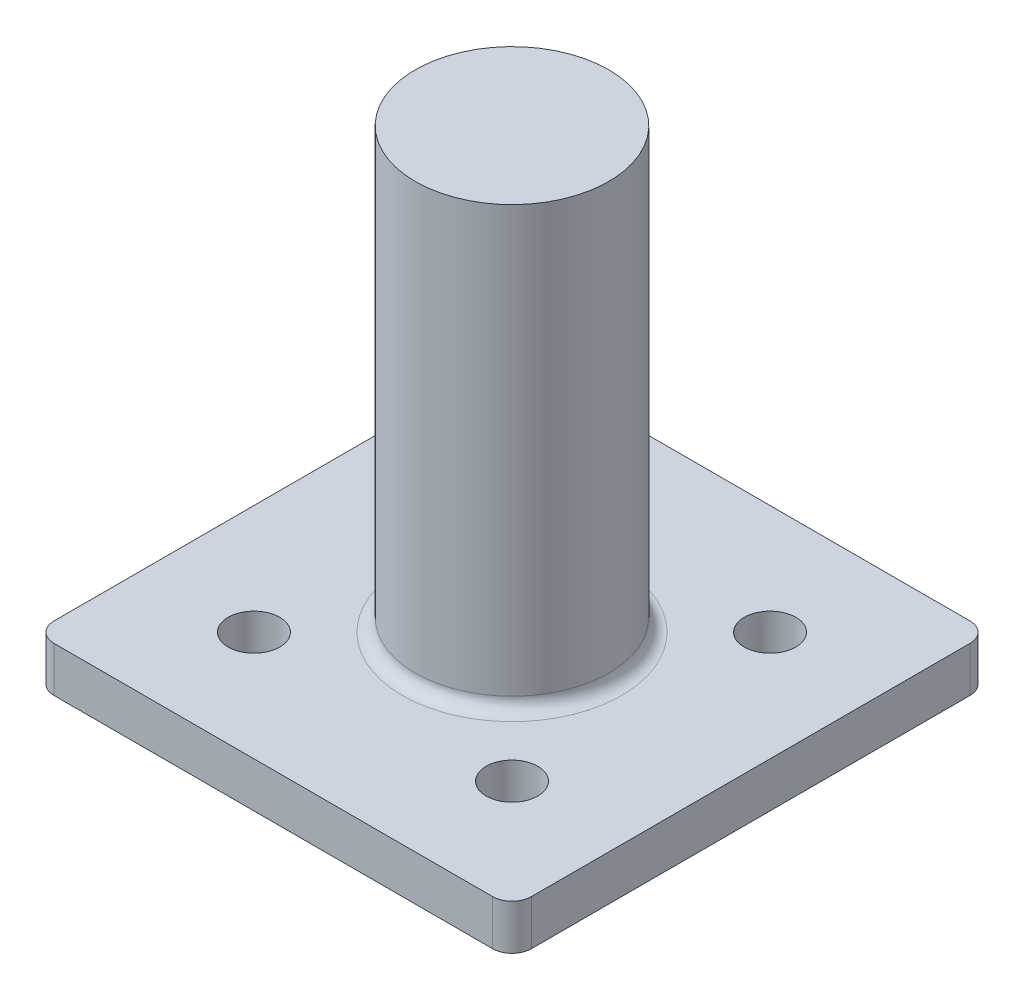
ISO-10303-21;
HEADER;
FILE_DESCRIPTION(('STEP AP214'),'2;1');
FILE_NAME('part.step','',(''),(''),'','','');
FILE_SCHEMA(('AUTOMOTIVE_DESIGN { 1 0 10303 214 1 1 1 1 }'));
ENDSEC;
DATA;
#1=APPLICATION_CONTEXT('core data for automotive mechanical design processes');
#2=APPLICATION_PROTOCOL_DEFINITION('international standard','automotive_design',2000,#1);
#3=PRODUCT_CONTEXT('',#1,'mechanical');
#4=PRODUCT('Part','Part','',(#3));
#5=PRODUCT_RELATED_PRODUCT_CATEGORY('part','',(#4));
#6=PRODUCT_DEFINITION_FORMATION('','',#4);
#7=PRODUCT_DEFINITION_CONTEXT('part definition',#1,'design');
#8=PRODUCT_DEFINITION('design','',#6,#7);
#9=PRODUCT_DEFINITION_SHAPE('','',#8);
#10=(LENGTH_UNIT() NAMED_UNIT(*) SI_UNIT(.MILLI.,.METRE.));
#11=(NAMED_UNIT(*) PLANE_ANGLE_UNIT() SI_UNIT($,.RADIAN.));
#12=(NAMED_UNIT(*) SI_UNIT($,.STERADIAN.) SOLID_ANGLE_UNIT());
#13=UNCERTAINTY_MEASURE_WITH_UNIT(LENGTH_MEASURE(1.E-05),#10,'distance_accuracy_value','');
#14=(GEOMETRIC_REPRESENTATION_CONTEXT(3) GLOBAL_UNCERTAINTY_ASSIGNED_CONTEXT((#13)) GLOBAL_UNIT_ASSIGNED_CONTEXT((#10,
#11,#12)) REPRESENTATION_CONTEXT('',''));
#15=CARTESIAN_POINT('',(0.,0.,0.));
#16=DIRECTION('',(0.,0.,1.));
#17=DIRECTION('',(1.,0.,0.));
#18=AXIS2_PLACEMENT_3D('',#15,#16,#17);
#19=CARTESIAN_POINT('',(3.,7.,-3.));
#20=DIRECTION('',(0.,-1.,0.));
#21=DIRECTION('',(0.,0.,-1.));
#22=AXIS2_PLACEMENT_3D('',#19,#20,#21);
#23=CYLINDRICAL_SURFACE('',#22,3.);
#24=CARTESIAN_POINT('',(3.,0.,-3.));
#25=DIRECTION('',(0.,1.,0.));
#26=DIRECTION('',(0.,0.,1.));
#27=AXIS2_PLACEMENT_3D('',#24,#25,#26);
#28=CIRCLE('',#27,3.);
#29=CARTESIAN_POINT('',(0.,0.,-3.00000000000002));
#30=VERTEX_POINT('',#29);
#31=CARTESIAN_POINT('',(3.00000000000002,0.,0.));
#32=VERTEX_POINT('',#31);
#33=EDGE_CURVE('E143',#30,#32,#28,.T.);
#34=ORIENTED_EDGE('',*,*,#33,.T.);
#35=DIRECTION('',(0.,-1.,0.));
#36=VECTOR('',#35,1.);
#37=CARTESIAN_POINT('',(3.00000000000002,7.,0.));
#38=LINE('',#37,#36);
#39=CARTESIAN_POINT('',(3.00000000000002,7.,0.));
#40=VERTEX_POINT('',#39);
#41=EDGE_CURVE('E171',#40,#32,#38,.T.);
#42=ORIENTED_EDGE('',*,*,#41,.F.);
#43=CARTESIAN_POINT('',(3.,7.,-3.));
#44=DIRECTION('',(0.,1.,0.));
#45=DIRECTION('',(0.,0.,1.));
#46=AXIS2_PLACEMENT_3D('',#43,#44,#45);
#47=CIRCLE('',#46,3.);
#48=CARTESIAN_POINT('',(0.,7.,-3.00000000000002));
#49=VERTEX_POINT('',#48);
#50=EDGE_CURVE('E158',#49,#40,#47,.T.);
#51=ORIENTED_EDGE('',*,*,#50,.F.);
#52=DIRECTION('',(0.,-1.,0.));
#53=VECTOR('',#52,1.);
#54=CARTESIAN_POINT('',(0.,7.,-3.00000000000002));
#55=LINE('',#54,#53);
#56=EDGE_CURVE('E139',#49,#30,#55,.T.);
#57=ORIENTED_EDGE('',*,*,#56,.T.);
#58=EDGE_LOOP('',(#34,#42,#51,#57));
#59=FACE_BOUND('',#58,.T.);
#60=ADVANCED_FACE('F43',(#59),#23,.T.);
#61=CARTESIAN_POINT('',(3.00000000000002,7.,0.));
#62=DIRECTION('',(0.,0.,-1.));
#63=DIRECTION('',(-1.,0.,0.));
#64=AXIS2_PLACEMENT_3D('',#61,#62,#63);
#65=PLANE('',#64);
#66=DIRECTION('',(1.,0.,0.));
#67=VECTOR('',#66,1.);
#68=CARTESIAN_POINT('',(3.00000000000002,0.,0.));
#69=LINE('',#68,#67);
#70=CARTESIAN_POINT('',(71.,0.,0.));
#71=VERTEX_POINT('',#70);
#72=EDGE_CURVE('E146',#32,#71,#69,.T.);
#73=ORIENTED_EDGE('',*,*,#72,.T.);
#74=DIRECTION('',(0.,-1.,0.));
#75=VECTOR('',#74,1.);
#76=CARTESIAN_POINT('',(71.,7.,0.));
#77=LINE('',#76,#75);
#78=CARTESIAN_POINT('',(71.,7.,0.));
#79=VERTEX_POINT('',#78);
#80=EDGE_CURVE('E168',#79,#71,#77,.T.);
#81=ORIENTED_EDGE('',*,*,#80,.F.);
#82=DIRECTION('',(1.,0.,0.));
#83=VECTOR('',#82,1.);
#84=CARTESIAN_POINT('',(3.00000000000002,7.,0.));
#85=LINE('',#84,#83);
#86=EDGE_CURVE('E106',#40,#79,#85,.T.);
#87=ORIENTED_EDGE('',*,*,#86,.F.);
#88=ORIENTED_EDGE('',*,*,#41,.T.);
#89=EDGE_LOOP('',(#73,#81,#87,#88));
#90=FACE_BOUND('',#89,.T.);
#91=ADVANCED_FACE('F236',(#90),#65,.F.);
#92=CARTESIAN_POINT('',(71.,7.,-3.));
#93=DIRECTION('',(0.,-1.,0.));
#94=DIRECTION('',(0.,0.,-1.));
#95=AXIS2_PLACEMENT_3D('',#92,#93,#94);
#96=CYLINDRICAL_SURFACE('',#95,3.);
#97=CARTESIAN_POINT('',(71.,0.,-3.));
#98=DIRECTION('',(0.,1.,0.));
#99=DIRECTION('',(0.,0.,-1.));
#100=AXIS2_PLACEMENT_3D('',#97,#98,#99);
#101=CIRCLE('',#100,3.);
#102=CARTESIAN_POINT('',(74.,0.,-3.));
#103=VERTEX_POINT('',#102);
#104=EDGE_CURVE('E149',#71,#103,#101,.T.);
#105=ORIENTED_EDGE('',*,*,#104,.T.);
#106=DIRECTION('',(0.,-1.,0.));
#107=VECTOR('',#106,1.);
#108=CARTESIAN_POINT('',(74.,7.,-3.));
#109=LINE('',#108,#107);
#110=CARTESIAN_POINT('',(74.,7.,-3.));
#111=VERTEX_POINT('',#110);
#112=EDGE_CURVE('E165',#111,#103,#109,.T.);
#113=ORIENTED_EDGE('',*,*,#112,.F.);
#114=CARTESIAN_POINT('',(71.,7.,-3.));
#115=DIRECTION('',(0.,1.,0.));
#116=DIRECTION('',(0.,0.,-1.));
#117=AXIS2_PLACEMENT_3D('',#114,#115,#116);
#118=CIRCLE('',#117,3.);
#119=EDGE_CURVE('E204',#79,#111,#118,.T.);
#120=ORIENTED_EDGE('',*,*,#119,.F.);
#121=ORIENTED_EDGE('',*,*,#80,.T.);
#122=EDGE_LOOP('',(#105,#113,#120,#121));
#123=FACE_BOUND('',#122,.T.);
#124=ADVANCED_FACE('F240',(#123),#96,.T.);
#125=CARTESIAN_POINT('',(74.,7.,-3.));
#126=DIRECTION('',(-1.,0.,0.));
#127=DIRECTION('',(0.,0.,1.));
#128=AXIS2_PLACEMENT_3D('',#125,#126,#127);
#129=PLANE('',#128);
#130=DIRECTION('',(0.,0.,-1.));
#131=VECTOR('',#130,1.);
#132=CARTESIAN_POINT('',(74.,0.,-3.));
#133=LINE('',#132,#131);
#134=CARTESIAN_POINT('',(74.,0.,-71.));
#135=VERTEX_POINT('',#134);
#136=EDGE_CURVE('E151',#103,#135,#133,.T.);
#137=ORIENTED_EDGE('',*,*,#136,.T.);
#138=DIRECTION('',(0.,-1.,0.));
#139=VECTOR('',#138,1.);
#140=CARTESIAN_POINT('',(74.,7.,-71.));
#141=LINE('',#140,#139);
#142=CARTESIAN_POINT('',(74.,7.,-71.));
#143=VERTEX_POINT('',#142);
#144=EDGE_CURVE('E162',#143,#135,#141,.T.);
#145=ORIENTED_EDGE('',*,*,#144,.F.);
#146=DIRECTION('',(0.,0.,-1.));
#147=VECTOR('',#146,1.);
#148=CARTESIAN_POINT('',(74.,7.,-3.));
#149=LINE('',#148,#147);
#150=EDGE_CURVE('E206',#111,#143,#149,.T.);
#151=ORIENTED_EDGE('',*,*,#150,.F.);
#152=ORIENTED_EDGE('',*,*,#112,.T.);
#153=EDGE_LOOP('',(#137,#145,#151,#152));
#154=FACE_BOUND('',#153,.T.);
#155=ADVANCED_FACE('F212',(#154),#129,.F.);
#156=CARTESIAN_POINT('',(71.,7.,-71.));
#157=DIRECTION('',(0.,-1.,0.));
#158=DIRECTION('',(0.,0.,-1.));
#159=AXIS2_PLACEMENT_3D('',#156,#157,#158);
#160=CYLINDRICAL_SURFACE('',#159,3.);
#161=CARTESIAN_POINT('',(71.,0.,-71.));
#162=DIRECTION('',(0.,1.,0.));
#163=DIRECTION('',(0.,0.,1.));
#164=AXIS2_PLACEMENT_3D('',#161,#162,#163);
#165=CIRCLE('',#164,3.);
#166=CARTESIAN_POINT('',(71.,0.,-74.));
#167=VERTEX_POINT('',#166);
#168=EDGE_CURVE('E153',#135,#167,#165,.T.);
#169=ORIENTED_EDGE('',*,*,#168,.T.);
#170=DIRECTION('',(0.,-1.,0.));
#171=VECTOR('',#170,1.);
#172=CARTESIAN_POINT('',(71.,7.,-74.));
#173=LINE('',#172,#171);
#174=CARTESIAN_POINT('',(71.,7.,-74.));
#175=VERTEX_POINT('',#174);
#176=EDGE_CURVE('E134',#175,#167,#173,.T.);
#177=ORIENTED_EDGE('',*,*,#176,.F.);
#178=CARTESIAN_POINT('',(71.,7.,-71.));
#179=DIRECTION('',(0.,1.,0.));
#180=DIRECTION('',(0.,0.,1.));
#181=AXIS2_PLACEMENT_3D('',#178,#179,#180);
#182=CIRCLE('',#181,3.);
#183=EDGE_CURVE('E125',#143,#175,#182,.T.);
#184=ORIENTED_EDGE('',*,*,#183,.F.);
#185=ORIENTED_EDGE('',*,*,#144,.T.);
#186=EDGE_LOOP('',(#169,#177,#184,#185));
#187=FACE_BOUND('',#186,.T.);
#188=ADVANCED_FACE('F216',(#187),#160,.T.);
#189=CARTESIAN_POINT('',(71.,7.,-74.));
#190=DIRECTION('',(0.,0.,1.));
#191=DIRECTION('',(1.,0.,0.));
#192=AXIS2_PLACEMENT_3D('',#189,#190,#191);
#193=PLANE('',#192);
#194=DIRECTION('',(-1.,0.,0.));
#195=VECTOR('',#194,1.);
#196=CARTESIAN_POINT('',(71.,0.,-74.));
#197=LINE('',#196,#195);
#198=CARTESIAN_POINT('',(3.,0.,-74.));
#199=VERTEX_POINT('',#198);
#200=EDGE_CURVE('E133',#167,#199,#197,.T.);
#201=ORIENTED_EDGE('',*,*,#200,.T.);
#202=DIRECTION('',(0.,-1.,0.));
#203=VECTOR('',#202,1.);
#204=CARTESIAN_POINT('',(3.,7.,-74.));
#205=LINE('',#204,#203);
#206=CARTESIAN_POINT('',(3.,7.,-74.));
#207=VERTEX_POINT('',#206);
#208=EDGE_CURVE('E130',#207,#199,#205,.T.);
#209=ORIENTED_EDGE('',*,*,#208,.F.);
#210=DIRECTION('',(-1.,0.,0.));
#211=VECTOR('',#210,1.);
#212=CARTESIAN_POINT('',(71.,7.,-74.));
#213=LINE('',#212,#211);
#214=EDGE_CURVE('E119',#175,#207,#213,.T.);
#215=ORIENTED_EDGE('',*,*,#214,.F.);
#216=ORIENTED_EDGE('',*,*,#176,.T.);
#217=EDGE_LOOP('',(#201,#209,#215,#216));
#218=FACE_BOUND('',#217,.T.);
#219=ADVANCED_FACE('F131',(#218),#193,.F.);
#220=CARTESIAN_POINT('',(3.,7.,-71.));
#221=DIRECTION('',(0.,-1.,0.));
#222=DIRECTION('',(0.,0.,-1.));
#223=AXIS2_PLACEMENT_3D('',#220,#221,#222);
#224=CYLINDRICAL_SURFACE('',#223,3.);
#225=CARTESIAN_POINT('',(3.,0.,-71.));
#226=DIRECTION('',(0.,1.,0.));
#227=DIRECTION('',(0.,0.,1.));
#228=AXIS2_PLACEMENT_3D('',#225,#226,#227);
#229=CIRCLE('',#228,3.);
#230=CARTESIAN_POINT('',(0.,0.,-71.));
#231=VERTEX_POINT('',#230);
#232=EDGE_CURVE('E91',#199,#231,#229,.T.);
#233=ORIENTED_EDGE('',*,*,#232,.T.);
#234=DIRECTION('',(0.,-1.,0.));
#235=VECTOR('',#234,1.);
#236=CARTESIAN_POINT('',(0.,7.,-71.));
#237=LINE('',#236,#235);
#238=CARTESIAN_POINT('',(0.,7.,-71.));
#239=VERTEX_POINT('',#238);
#240=EDGE_CURVE('E135',#239,#231,#237,.T.);
#241=ORIENTED_EDGE('',*,*,#240,.F.);
#242=CARTESIAN_POINT('',(3.,7.,-71.));
#243=DIRECTION('',(0.,1.,0.));
#244=DIRECTION('',(0.,0.,1.));
#245=AXIS2_PLACEMENT_3D('',#242,#243,#244);
#246=CIRCLE('',#245,3.);
#247=EDGE_CURVE('E123',#207,#239,#246,.T.);
#248=ORIENTED_EDGE('',*,*,#247,.F.);
#249=ORIENTED_EDGE('',*,*,#208,.T.);
#250=EDGE_LOOP('',(#233,#241,#248,#249));
#251=FACE_BOUND('',#250,.T.);
#252=ADVANCED_FACE('F137',(#251),#224,.T.);
#253=CARTESIAN_POINT('',(0.,7.,-71.));
#254=DIRECTION('',(1.,0.,0.));
#255=DIRECTION('',(0.,0.,-1.));
#256=AXIS2_PLACEMENT_3D('',#253,#254,#255);
#257=PLANE('',#256);
#258=DIRECTION('',(0.,0.,1.));
#259=VECTOR('',#258,1.);
#260=CARTESIAN_POINT('',(0.,0.,-71.));
#261=LINE('',#260,#259);
#262=EDGE_CURVE('E97',#231,#30,#261,.T.);
#263=ORIENTED_EDGE('',*,*,#262,.T.);
#264=ORIENTED_EDGE('',*,*,#56,.F.);
#265=DIRECTION('',(0.,0.,1.));
#266=VECTOR('',#265,1.);
#267=CARTESIAN_POINT('',(0.,7.,-71.));
#268=LINE('',#267,#266);
#269=EDGE_CURVE('E62',#239,#49,#268,.T.);
#270=ORIENTED_EDGE('',*,*,#269,.F.);
#271=ORIENTED_EDGE('',*,*,#240,.T.);
#272=EDGE_LOOP('',(#263,#264,#270,#271));
#273=FACE_BOUND('',#272,.T.);
#274=ADVANCED_FACE('F224',(#273),#257,.F.);
#275=CARTESIAN_POINT('',(3.,7.,-3.));
#276=DIRECTION('',(0.,1.,0.));
#277=DIRECTION('',(0.,0.,1.));
#278=AXIS2_PLACEMENT_3D('',#275,#276,#277);
#279=PLANE('',#278);
#280=CARTESIAN_POINT('',(17.,7.,-57.));
#281=DIRECTION('',(0.,-1.,0.));
#282=DIRECTION('',(0.,0.,-1.));
#283=AXIS2_PLACEMENT_3D('',#280,#281,#282);
#284=CIRCLE('',#283,4.);
#285=CARTESIAN_POINT('',(17.,7.,-61.));
#286=VERTEX_POINT('',#285);
#287=EDGE_CURVE('E183',#286,#286,#284,.T.);
#288=ORIENTED_EDGE('',*,*,#287,.T.);
#289=EDGE_LOOP('',(#288));
#290=FACE_BOUND('',#289,.T.);
#291=CARTESIAN_POINT('',(57.,7.,-57.));
#292=DIRECTION('',(0.,-1.,0.));
#293=DIRECTION('',(0.,0.,-1.));
#294=AXIS2_PLACEMENT_3D('',#291,#292,#293);
#295=CIRCLE('',#294,4.00000000000001);
#296=CARTESIAN_POINT('',(57.,7.,-61.));
#297=VERTEX_POINT('',#296);
#298=EDGE_CURVE('E189',#297,#297,#295,.T.);
#299=ORIENTED_EDGE('',*,*,#298,.T.);
#300=EDGE_LOOP('',(#299));
#301=FACE_BOUND('',#300,.T.);
#302=CARTESIAN_POINT('',(17.,7.,-17.));
#303=DIRECTION('',(0.,1.,0.));
#304=DIRECTION('',(0.,0.,1.));
#305=AXIS2_PLACEMENT_3D('',#302,#303,#304);
#306=CIRCLE('',#305,4.);
#307=CARTESIAN_POINT('',(17.,7.,-13.));
#308=VERTEX_POINT('',#307);
#309=EDGE_CURVE('E179',#308,#308,#306,.T.);
#310=ORIENTED_EDGE('',*,*,#309,.F.);
#311=EDGE_LOOP('',(#310));
#312=FACE_BOUND('',#311,.T.);
#313=CARTESIAN_POINT('',(57.,7.,-17.));
#314=DIRECTION('',(0.,1.,0.));
#315=DIRECTION('',(0.,0.,1.));
#316=AXIS2_PLACEMENT_3D('',#313,#314,#315);
#317=CIRCLE('',#316,4.00000000000001);
#318=CARTESIAN_POINT('',(57.,7.,-13.));
#319=VERTEX_POINT('',#318);
#320=EDGE_CURVE('E187',#319,#319,#317,.T.);
#321=ORIENTED_EDGE('',*,*,#320,.F.);
#322=EDGE_LOOP('',(#321));
#323=FACE_BOUND('',#322,.T.);
#324=CARTESIAN_POINT('',(37.,7.,-37.));
#325=DIRECTION('',(0.,1.,0.));
#326=DIRECTION('',(0.,0.,1.));
#327=AXIS2_PLACEMENT_3D('',#324,#325,#326);
#328=CIRCLE('',#327,17.);
#329=CARTESIAN_POINT('',(37.,7.,-20.));
#330=VERTEX_POINT('',#329);
#331=EDGE_CURVE('E11',#330,#330,#328,.F.);
#332=ORIENTED_EDGE('',*,*,#331,.T.);
#333=EDGE_LOOP('',(#332));
#334=FACE_BOUND('',#333,.T.);
#335=ORIENTED_EDGE('',*,*,#50,.T.);
#336=ORIENTED_EDGE('',*,*,#86,.T.);
#337=ORIENTED_EDGE('',*,*,#119,.T.);
#338=ORIENTED_EDGE('',*,*,#150,.T.);
#339=ORIENTED_EDGE('',*,*,#183,.T.);
#340=ORIENTED_EDGE('',*,*,#214,.T.);
#341=ORIENTED_EDGE('',*,*,#247,.T.);
#342=ORIENTED_EDGE('',*,*,#269,.T.);
#343=EDGE_LOOP('',(#335,#336,#337,#338,#339,#340,#341,#342));
#344=FACE_BOUND('',#343,.T.);
#345=ADVANCED_FACE('F121',(#290,#301,#312,#323,#334,#344),#279,.T.);
#346=CARTESIAN_POINT('',(3.,0.,-3.));
#347=DIRECTION('',(0.,1.,0.));
#348=DIRECTION('',(0.,0.,1.));
#349=AXIS2_PLACEMENT_3D('',#346,#347,#348);
#350=PLANE('',#349);
#351=CARTESIAN_POINT('',(17.,0.,-57.));
#352=DIRECTION('',(0.,1.,0.));
#353=DIRECTION('',(0.,0.,1.));
#354=AXIS2_PLACEMENT_3D('',#351,#352,#353);
#355=CIRCLE('',#354,4.);
#356=CARTESIAN_POINT('',(17.,0.,-53.));
#357=VERTEX_POINT('',#356);
#358=EDGE_CURVE('E47',#357,#357,#355,.F.);
#359=ORIENTED_EDGE('',*,*,#358,.F.);
#360=EDGE_LOOP('',(#359));
#361=FACE_BOUND('',#360,.T.);
#362=CARTESIAN_POINT('',(57.,0.,-57.));
#363=DIRECTION('',(0.,1.,0.));
#364=DIRECTION('',(0.,0.,1.));
#365=AXIS2_PLACEMENT_3D('',#362,#363,#364);
#366=CIRCLE('',#365,4.00000000000001);
#367=CARTESIAN_POINT('',(57.,0.,-53.));
#368=VERTEX_POINT('',#367);
#369=EDGE_CURVE('E181',#368,#368,#366,.F.);
#370=ORIENTED_EDGE('',*,*,#369,.F.);
#371=EDGE_LOOP('',(#370));
#372=FACE_BOUND('',#371,.T.);
#373=CARTESIAN_POINT('',(17.,0.,-17.));
#374=DIRECTION('',(0.,1.,0.));
#375=DIRECTION('',(0.,0.,1.));
#376=AXIS2_PLACEMENT_3D('',#373,#374,#375);
#377=CIRCLE('',#376,4.);
#378=CARTESIAN_POINT('',(17.,0.,-13.));
#379=VERTEX_POINT('',#378);
#380=EDGE_CURVE('E178',#379,#379,#377,.T.);
#381=ORIENTED_EDGE('',*,*,#380,.T.);
#382=EDGE_LOOP('',(#381));
#383=FACE_BOUND('',#382,.T.);
#384=CARTESIAN_POINT('',(57.,0.,-17.));
#385=DIRECTION('',(0.,1.,0.));
#386=DIRECTION('',(0.,0.,1.));
#387=AXIS2_PLACEMENT_3D('',#384,#385,#386);
#388=CIRCLE('',#387,4.00000000000001);
#389=CARTESIAN_POINT('',(57.,0.,-13.));
#390=VERTEX_POINT('',#389);
#391=EDGE_CURVE('E175',#390,#390,#388,.T.);
#392=ORIENTED_EDGE('',*,*,#391,.T.);
#393=EDGE_LOOP('',(#392));
#394=FACE_BOUND('',#393,.T.);
#395=ORIENTED_EDGE('',*,*,#33,.F.);
#396=ORIENTED_EDGE('',*,*,#262,.F.);
#397=ORIENTED_EDGE('',*,*,#232,.F.);
#398=ORIENTED_EDGE('',*,*,#200,.F.);
#399=ORIENTED_EDGE('',*,*,#168,.F.);
#400=ORIENTED_EDGE('',*,*,#136,.F.);
#401=ORIENTED_EDGE('',*,*,#104,.F.);
#402=ORIENTED_EDGE('',*,*,#72,.F.);
#403=EDGE_LOOP('',(#395,#396,#397,#398,#399,#400,#401,#402));
#404=FACE_BOUND('',#403,.T.);
#405=ADVANCED_FACE('F219',(#361,#372,#383,#394,#404),#350,.F.);
#406=CARTESIAN_POINT('',(37.,75.,-37.));
#407=DIRECTION('',(0.,-1.,0.));
#408=DIRECTION('',(0.,0.,-1.));
#409=AXIS2_PLACEMENT_3D('',#406,#407,#408);
#410=CYLINDRICAL_SURFACE('',#409,15.);
#411=CARTESIAN_POINT('',(37.,9.00000000000001,-37.));
#412=DIRECTION('',(0.,1.,0.));
#413=DIRECTION('',(0.,0.,1.));
#414=AXIS2_PLACEMENT_3D('',#411,#412,#413);
#415=CIRCLE('',#414,15.);
#416=CARTESIAN_POINT('',(37.,9.00000000000001,-22.));
#417=VERTEX_POINT('',#416);
#418=EDGE_CURVE('E53',#417,#417,#415,.T.);
#419=ORIENTED_EDGE('',*,*,#418,.T.);
#420=EDGE_LOOP('',(#419));
#421=FACE_BOUND('',#420,.T.);
#422=CARTESIAN_POINT('',(37.,75.,-37.));
#423=DIRECTION('',(0.,1.,0.));
#424=DIRECTION('',(0.,0.,1.));
#425=AXIS2_PLACEMENT_3D('',#422,#423,#424);
#426=CIRCLE('',#425,15.);
#427=CARTESIAN_POINT('',(37.,75.,-22.));
#428=VERTEX_POINT('',#427);
#429=EDGE_CURVE('E147',#428,#428,#426,.T.);
#430=ORIENTED_EDGE('',*,*,#429,.F.);
#431=EDGE_LOOP('',(#430));
#432=FACE_BOUND('',#431,.T.);
#433=ADVANCED_FACE('F281',(#421,#432),#410,.T.);
#434=CARTESIAN_POINT('',(37.,75.,-37.));
#435=DIRECTION('',(0.,1.,0.));
#436=DIRECTION('',(0.,0.,1.));
#437=AXIS2_PLACEMENT_3D('',#434,#435,#436);
#438=PLANE('',#437);
#439=ORIENTED_EDGE('',*,*,#429,.T.);
#440=EDGE_LOOP('',(#439));
#441=FACE_BOUND('',#440,.T.);
#442=ADVANCED_FACE('F291',(#441),#438,.T.);
#443=CARTESIAN_POINT('',(37.,9.00000000000001,-37.));
#444=DIRECTION('',(0.,1.,0.));
#445=DIRECTION('',(0.,0.,1.));
#446=AXIS2_PLACEMENT_3D('',#443,#444,#445);
#447=TOROIDAL_SURFACE('',#446,17.,2.);
#448=ORIENTED_EDGE('',*,*,#331,.F.);
#449=EDGE_LOOP('',(#448));
#450=FACE_BOUND('',#449,.T.);
#451=ORIENTED_EDGE('',*,*,#418,.F.);
#452=EDGE_LOOP('',(#451));
#453=FACE_BOUND('',#452,.T.);
#454=ADVANCED_FACE('F45',(#450,#453),#447,.F.);
#455=CARTESIAN_POINT('',(57.,-3.,-17.));
#456=DIRECTION('',(0.,1.,0.));
#457=DIRECTION('',(0.,0.,1.));
#458=AXIS2_PLACEMENT_3D('',#455,#456,#457);
#459=CYLINDRICAL_SURFACE('',#458,4.00000000000001);
#460=ORIENTED_EDGE('',*,*,#320,.T.);
#461=EDGE_LOOP('',(#460));
#462=FACE_BOUND('',#461,.T.);
#463=ORIENTED_EDGE('',*,*,#391,.F.);
#464=EDGE_LOOP('',(#463));
#465=FACE_BOUND('',#464,.T.);
#466=ADVANCED_FACE('F309',(#462,#465),#459,.F.);
#467=CARTESIAN_POINT('',(17.,-3.,-17.));
#468=DIRECTION('',(0.,1.,0.));
#469=DIRECTION('',(0.,0.,1.));
#470=AXIS2_PLACEMENT_3D('',#467,#468,#469);
#471=CYLINDRICAL_SURFACE('',#470,4.);
#472=ORIENTED_EDGE('',*,*,#309,.T.);
#473=EDGE_LOOP('',(#472));
#474=FACE_BOUND('',#473,.T.);
#475=ORIENTED_EDGE('',*,*,#380,.F.);
#476=EDGE_LOOP('',(#475));
#477=FACE_BOUND('',#476,.T.);
#478=ADVANCED_FACE('F318',(#474,#477),#471,.F.);
#479=CARTESIAN_POINT('',(57.,-3.,-57.));
#480=DIRECTION('',(0.,1.,0.));
#481=DIRECTION('',(0.,0.,1.));
#482=AXIS2_PLACEMENT_3D('',#479,#480,#481);
#483=CYLINDRICAL_SURFACE('',#482,4.00000000000001);
#484=ORIENTED_EDGE('',*,*,#298,.F.);
#485=EDGE_LOOP('',(#484));
#486=FACE_BOUND('',#485,.T.);
#487=ORIENTED_EDGE('',*,*,#369,.T.);
#488=EDGE_LOOP('',(#487));
#489=FACE_BOUND('',#488,.T.);
#490=ADVANCED_FACE('F327',(#486,#489),#483,.F.);
#491=CARTESIAN_POINT('',(17.,-3.,-57.));
#492=DIRECTION('',(0.,1.,0.));
#493=DIRECTION('',(0.,0.,1.));
#494=AXIS2_PLACEMENT_3D('',#491,#492,#493);
#495=CYLINDRICAL_SURFACE('',#494,4.);
#496=ORIENTED_EDGE('',*,*,#287,.F.);
#497=EDGE_LOOP('',(#496));
#498=FACE_BOUND('',#497,.T.);
#499=ORIENTED_EDGE('',*,*,#358,.T.);
#500=EDGE_LOOP('',(#499));
#501=FACE_BOUND('',#500,.T.);
#502=ADVANCED_FACE('F337',(#498,#501),#495,.F.);
#503=CLOSED_SHELL('',(#60,#91,#124,#155,#188,#219,#252,#274,#345,#405,#433,#442,#454,#466,#478,
#490,#502));
#504=MANIFOLD_SOLID_BREP('B2',#503);
#505=ADVANCED_BREP_SHAPE_REPRESENTATION('',(#18,#504),#14);
#506=SHAPE_DEFINITION_REPRESENTATION(#9,#505);
ENDSEC;
END-ISO-10303-21;
